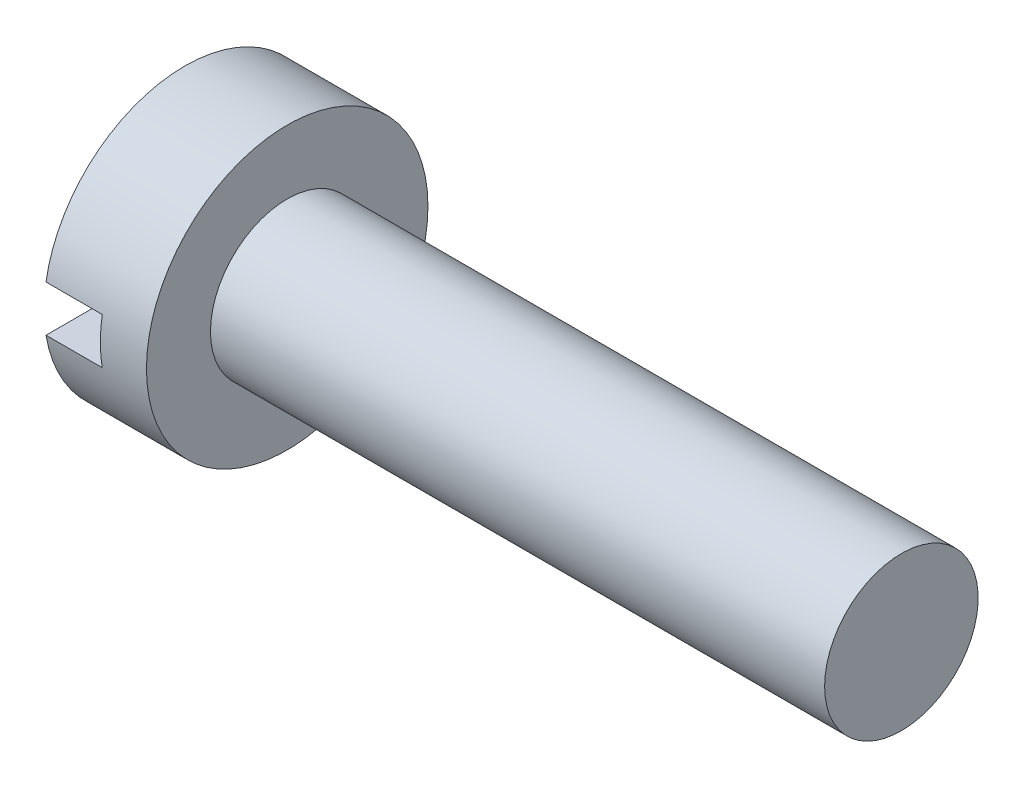
ISO-10303-21;
HEADER;
FILE_DESCRIPTION(('STEP AP214'),'2;1');
FILE_NAME('part.step','',(''),(''),'','','');
FILE_SCHEMA(('AUTOMOTIVE_DESIGN { 1 0 10303 214 1 1 1 1 }'));
ENDSEC;
DATA;
#1=APPLICATION_CONTEXT('core data for automotive mechanical design processes');
#2=APPLICATION_PROTOCOL_DEFINITION('international standard','automotive_design',2000,#1);
#3=PRODUCT_CONTEXT('',#1,'mechanical');
#4=PRODUCT('Part','Part','',(#3));
#5=PRODUCT_RELATED_PRODUCT_CATEGORY('part','',(#4));
#6=PRODUCT_DEFINITION_FORMATION('','',#4);
#7=PRODUCT_DEFINITION_CONTEXT('part definition',#1,'design');
#8=PRODUCT_DEFINITION('design','',#6,#7);
#9=PRODUCT_DEFINITION_SHAPE('','',#8);
#10=(LENGTH_UNIT() NAMED_UNIT(*) SI_UNIT(.MILLI.,.METRE.));
#11=(NAMED_UNIT(*) PLANE_ANGLE_UNIT() SI_UNIT($,.RADIAN.));
#12=(NAMED_UNIT(*) SI_UNIT($,.STERADIAN.) SOLID_ANGLE_UNIT());
#13=UNCERTAINTY_MEASURE_WITH_UNIT(LENGTH_MEASURE(1.E-05),#10,'distance_accuracy_value','');
#14=(GEOMETRIC_REPRESENTATION_CONTEXT(3) GLOBAL_UNCERTAINTY_ASSIGNED_CONTEXT((#13)) GLOBAL_UNIT_ASSIGNED_CONTEXT((#10,
#11,#12)) REPRESENTATION_CONTEXT('',''));
#15=CARTESIAN_POINT('',(0.,0.,0.));
#16=DIRECTION('',(0.,0.,1.));
#17=DIRECTION('',(1.,0.,0.));
#18=AXIS2_PLACEMENT_3D('',#15,#16,#17);
#19=CARTESIAN_POINT('',(0.,0.,0.));
#20=DIRECTION('',(-1.,0.,0.));
#21=DIRECTION('',(0.,0.,1.));
#22=AXIS2_PLACEMENT_3D('',#19,#20,#21);
#23=PLANE('',#22);
#24=DIRECTION('',(0.,0.,-1.));
#25=VECTOR('',#24,1.);
#26=CARTESIAN_POINT('',(0.,0.45,2.75));
#27=LINE('',#26,#25);
#28=CARTESIAN_POINT('',(0.,0.45,2.71293199325011));
#29=VERTEX_POINT('',#28);
#30=CARTESIAN_POINT('',(0.,0.45,-2.71293199325011));
#31=VERTEX_POINT('',#30);
#32=EDGE_CURVE('E93',#29,#31,#27,.T.);
#33=ORIENTED_EDGE('',*,*,#32,.F.);
#34=CARTESIAN_POINT('',(0.,0.,0.));
#35=DIRECTION('',(-1.,0.,0.));
#36=DIRECTION('',(0.,0.,1.));
#37=AXIS2_PLACEMENT_3D('',#34,#35,#36);
#38=CIRCLE('',#37,2.75);
#39=EDGE_CURVE('E99',#29,#31,#38,.T.);
#40=ORIENTED_EDGE('',*,*,#39,.T.);
#41=EDGE_LOOP('',(#33,#40));
#42=FACE_BOUND('',#41,.T.);
#43=ADVANCED_FACE('F41',(#42),#23,.T.);
#44=CARTESIAN_POINT('',(-25.4,0.,0.));
#45=DIRECTION('',(-1.,0.,0.));
#46=DIRECTION('',(0.,0.,1.));
#47=AXIS2_PLACEMENT_3D('',#44,#45,#46);
#48=CYLINDRICAL_SURFACE('',#47,1.5);
#49=CARTESIAN_POINT('',(14.,0.,0.));
#50=DIRECTION('',(-1.,0.,0.));
#51=DIRECTION('',(0.,0.,1.));
#52=AXIS2_PLACEMENT_3D('',#49,#50,#51);
#53=CIRCLE('',#52,1.5);
#54=CARTESIAN_POINT('',(14.,0.,1.5));
#55=VERTEX_POINT('',#54);
#56=EDGE_CURVE('E103',#55,#55,#53,.T.);
#57=ORIENTED_EDGE('',*,*,#56,.T.);
#58=EDGE_LOOP('',(#57));
#59=FACE_BOUND('',#58,.T.);
#60=CARTESIAN_POINT('',(2.,0.,0.));
#61=DIRECTION('',(-1.,0.,0.));
#62=DIRECTION('',(0.,0.,1.));
#63=AXIS2_PLACEMENT_3D('',#60,#61,#62);
#64=CIRCLE('',#63,1.5);
#65=CARTESIAN_POINT('',(2.,0.,1.5));
#66=VERTEX_POINT('',#65);
#67=EDGE_CURVE('E105',#66,#66,#64,.T.);
#68=ORIENTED_EDGE('',*,*,#67,.F.);
#69=EDGE_LOOP('',(#68));
#70=FACE_BOUND('',#69,.T.);
#71=ADVANCED_FACE('F43',(#59,#70),#48,.T.);
#72=CARTESIAN_POINT('',(14.,1.5,0.));
#73=DIRECTION('',(1.,0.,0.));
#74=DIRECTION('',(0.,0.,-1.));
#75=AXIS2_PLACEMENT_3D('',#72,#73,#74);
#76=PLANE('',#75);
#77=ORIENTED_EDGE('',*,*,#56,.F.);
#78=EDGE_LOOP('',(#77));
#79=FACE_BOUND('',#78,.T.);
#80=ADVANCED_FACE('F142',(#79),#76,.T.);
#81=DIRECTION('',(0.,0.,1.));
#82=VECTOR('',#81,1.);
#83=CARTESIAN_POINT('',(0.,-0.45,-2.75));
#84=LINE('',#83,#82);
#85=CARTESIAN_POINT('',(0.,-0.45,-2.71293199325011));
#86=VERTEX_POINT('',#85);
#87=CARTESIAN_POINT('',(0.,-0.45,2.71293199325011));
#88=VERTEX_POINT('',#87);
#89=EDGE_CURVE('E85',#86,#88,#84,.T.);
#90=ORIENTED_EDGE('',*,*,#89,.F.);
#91=EDGE_CURVE('E91',#86,#88,#38,.T.);
#92=ORIENTED_EDGE('',*,*,#91,.T.);
#93=EDGE_LOOP('',(#90,#92));
#94=FACE_BOUND('',#93,.T.);
#95=ADVANCED_FACE('F90',(#94),#23,.T.);
#96=CARTESIAN_POINT('',(-25.4,0.,0.));
#97=DIRECTION('',(-1.,0.,0.));
#98=DIRECTION('',(0.,0.,1.));
#99=AXIS2_PLACEMENT_3D('',#96,#97,#98);
#100=CYLINDRICAL_SURFACE('',#99,2.75);
#101=DIRECTION('',(-1.,0.,0.));
#102=VECTOR('',#101,1.);
#103=CARTESIAN_POINT('',(-25.4,0.45,-2.71293199325011));
#104=LINE('',#103,#102);
#105=CARTESIAN_POINT('',(1.1,0.45,-2.71293199325011));
#106=VERTEX_POINT('',#105);
#107=EDGE_CURVE('E11',#31,#106,#104,.F.);
#108=ORIENTED_EDGE('',*,*,#107,.F.);
#109=ORIENTED_EDGE('',*,*,#39,.F.);
#110=DIRECTION('',(-1.,0.,0.));
#111=VECTOR('',#110,1.);
#112=CARTESIAN_POINT('',(-25.4,0.45,2.71293199325011));
#113=LINE('',#112,#111);
#114=CARTESIAN_POINT('',(1.1,0.45,2.71293199325011));
#115=VERTEX_POINT('',#114);
#116=EDGE_CURVE('E113',#115,#29,#113,.T.);
#117=ORIENTED_EDGE('',*,*,#116,.F.);
#118=CARTESIAN_POINT('',(1.1,0.,0.));
#119=DIRECTION('',(-1.,0.,0.));
#120=DIRECTION('',(0.,0.,1.));
#121=AXIS2_PLACEMENT_3D('',#118,#119,#120);
#122=CIRCLE('',#121,2.75);
#123=CARTESIAN_POINT('',(1.1,-0.45,2.71293199325011));
#124=VERTEX_POINT('',#123);
#125=EDGE_CURVE('E56',#115,#124,#122,.F.);
#126=ORIENTED_EDGE('',*,*,#125,.T.);
#127=DIRECTION('',(-1.,0.,0.));
#128=VECTOR('',#127,1.);
#129=CARTESIAN_POINT('',(-25.4,-0.45,2.71293199325011));
#130=LINE('',#129,#128);
#131=EDGE_CURVE('E98',#88,#124,#130,.F.);
#132=ORIENTED_EDGE('',*,*,#131,.F.);
#133=ORIENTED_EDGE('',*,*,#91,.F.);
#134=DIRECTION('',(-1.,0.,0.));
#135=VECTOR('',#134,1.);
#136=CARTESIAN_POINT('',(-25.4,-0.45,-2.71293199325011));
#137=LINE('',#136,#135);
#138=CARTESIAN_POINT('',(1.1,-0.45,-2.71293199325011));
#139=VERTEX_POINT('',#138);
#140=EDGE_CURVE('E49',#139,#86,#137,.T.);
#141=ORIENTED_EDGE('',*,*,#140,.F.);
#142=EDGE_CURVE('E64',#139,#106,#122,.F.);
#143=ORIENTED_EDGE('',*,*,#142,.T.);
#144=EDGE_LOOP('',(#108,#109,#117,#126,#132,#133,#141,#143));
#145=FACE_BOUND('',#144,.T.);
#146=CARTESIAN_POINT('',(2.,0.,0.));
#147=DIRECTION('',(-1.,0.,0.));
#148=DIRECTION('',(0.,0.,1.));
#149=AXIS2_PLACEMENT_3D('',#146,#147,#148);
#150=CIRCLE('',#149,2.75);
#151=CARTESIAN_POINT('',(2.,0.,2.75));
#152=VERTEX_POINT('',#151);
#153=EDGE_CURVE('E100',#152,#152,#150,.T.);
#154=ORIENTED_EDGE('',*,*,#153,.T.);
#155=EDGE_LOOP('',(#154));
#156=FACE_BOUND('',#155,.T.);
#157=ADVANCED_FACE('F96',(#145,#156),#100,.T.);
#158=CARTESIAN_POINT('',(2.,1.5,0.));
#159=DIRECTION('',(-1.,0.,0.));
#160=DIRECTION('',(0.,0.,1.));
#161=AXIS2_PLACEMENT_3D('',#158,#159,#160);
#162=PLANE('',#161);
#163=ORIENTED_EDGE('',*,*,#153,.F.);
#164=EDGE_LOOP('',(#163));
#165=FACE_BOUND('',#164,.T.);
#166=ORIENTED_EDGE('',*,*,#67,.T.);
#167=EDGE_LOOP('',(#166));
#168=FACE_BOUND('',#167,.T.);
#169=ADVANCED_FACE('F128',(#165,#168),#162,.F.);
#170=CARTESIAN_POINT('',(1.1,0.45,2.75));
#171=DIRECTION('',(0.,1.,0.));
#172=DIRECTION('',(0.,0.,1.));
#173=AXIS2_PLACEMENT_3D('',#170,#171,#172);
#174=PLANE('',#173);
#175=ORIENTED_EDGE('',*,*,#107,.T.);
#176=DIRECTION('',(0.,0.,-1.));
#177=VECTOR('',#176,1.);
#178=CARTESIAN_POINT('',(1.1,0.45,2.75));
#179=LINE('',#178,#177);
#180=EDGE_CURVE('E92',#115,#106,#179,.T.);
#181=ORIENTED_EDGE('',*,*,#180,.F.);
#182=ORIENTED_EDGE('',*,*,#116,.T.);
#183=ORIENTED_EDGE('',*,*,#32,.T.);
#184=EDGE_LOOP('',(#175,#181,#182,#183));
#185=FACE_BOUND('',#184,.T.);
#186=ADVANCED_FACE('F126',(#185),#174,.F.);
#187=CARTESIAN_POINT('',(1.1,-0.45,-2.75));
#188=DIRECTION('',(0.,-1.,0.));
#189=DIRECTION('',(0.,0.,-1.));
#190=AXIS2_PLACEMENT_3D('',#187,#188,#189);
#191=PLANE('',#190);
#192=ORIENTED_EDGE('',*,*,#131,.T.);
#193=DIRECTION('',(0.,0.,1.));
#194=VECTOR('',#193,1.);
#195=CARTESIAN_POINT('',(1.1,-0.45,-2.75));
#196=LINE('',#195,#194);
#197=EDGE_CURVE('E86',#139,#124,#196,.T.);
#198=ORIENTED_EDGE('',*,*,#197,.F.);
#199=ORIENTED_EDGE('',*,*,#140,.T.);
#200=ORIENTED_EDGE('',*,*,#89,.T.);
#201=EDGE_LOOP('',(#192,#198,#199,#200));
#202=FACE_BOUND('',#201,.T.);
#203=ADVANCED_FACE('F84',(#202),#191,.F.);
#204=CARTESIAN_POINT('',(1.1,0.45,-2.75));
#205=DIRECTION('',(-1.,0.,0.));
#206=DIRECTION('',(0.,0.,1.));
#207=AXIS2_PLACEMENT_3D('',#204,#205,#206);
#208=PLANE('',#207);
#209=ORIENTED_EDGE('',*,*,#197,.T.);
#210=ORIENTED_EDGE('',*,*,#125,.F.);
#211=ORIENTED_EDGE('',*,*,#180,.T.);
#212=ORIENTED_EDGE('',*,*,#142,.F.);
#213=EDGE_LOOP('',(#209,#210,#211,#212));
#214=FACE_BOUND('',#213,.T.);
#215=ADVANCED_FACE('F125',(#214),#208,.T.);
#216=CLOSED_SHELL('',(#43,#71,#80,#95,#157,#169,#186,#203,#215));
#217=MANIFOLD_SOLID_BREP('B2',#216);
#218=ADVANCED_BREP_SHAPE_REPRESENTATION('',(#18,#217),#14);
#219=SHAPE_DEFINITION_REPRESENTATION(#9,#218);
ENDSEC;
END-ISO-10303-21;
